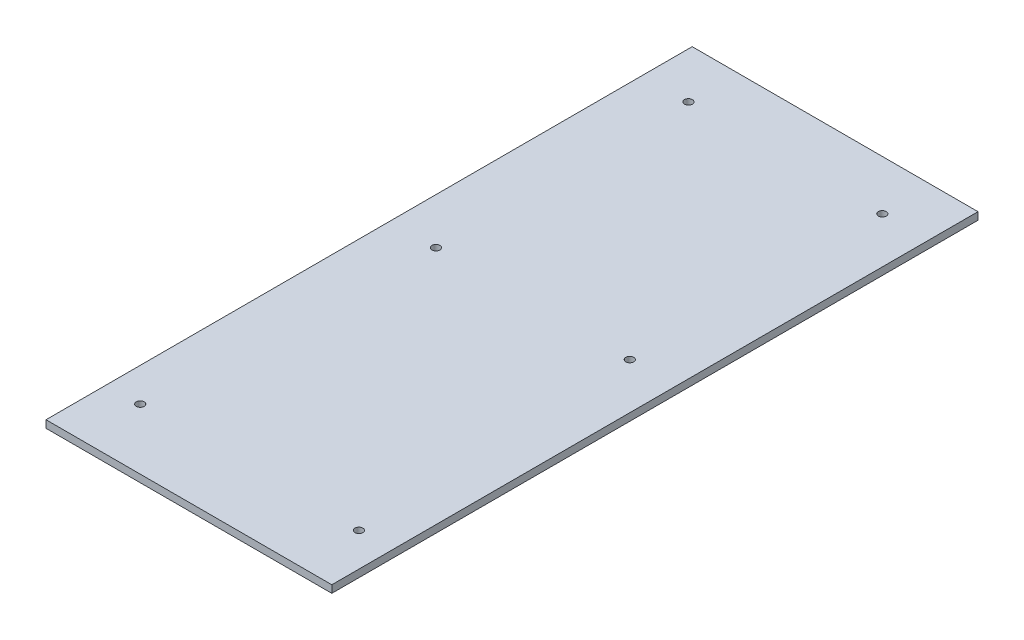
ISO-10303-21;
HEADER;
FILE_DESCRIPTION(('STEP AP214'),'2;1');
FILE_NAME('part.step','',(''),(''),'','','');
FILE_SCHEMA(('AUTOMOTIVE_DESIGN { 1 0 10303 214 1 1 1 1 }'));
ENDSEC;
DATA;
#1=APPLICATION_CONTEXT('core data for automotive mechanical design processes');
#2=APPLICATION_PROTOCOL_DEFINITION('international standard','automotive_design',2000,#1);
#3=PRODUCT_CONTEXT('',#1,'mechanical');
#4=PRODUCT('Part','Part','',(#3));
#5=PRODUCT_RELATED_PRODUCT_CATEGORY('part','',(#4));
#6=PRODUCT_DEFINITION_FORMATION('','',#4);
#7=PRODUCT_DEFINITION_CONTEXT('part definition',#1,'design');
#8=PRODUCT_DEFINITION('design','',#6,#7);
#9=PRODUCT_DEFINITION_SHAPE('','',#8);
#10=(LENGTH_UNIT() NAMED_UNIT(*) SI_UNIT(.MILLI.,.METRE.));
#11=(NAMED_UNIT(*) PLANE_ANGLE_UNIT() SI_UNIT($,.RADIAN.));
#12=(NAMED_UNIT(*) SI_UNIT($,.STERADIAN.) SOLID_ANGLE_UNIT());
#13=UNCERTAINTY_MEASURE_WITH_UNIT(LENGTH_MEASURE(1.E-05),#10,'distance_accuracy_value','');
#14=(GEOMETRIC_REPRESENTATION_CONTEXT(3) GLOBAL_UNCERTAINTY_ASSIGNED_CONTEXT((#13)) GLOBAL_UNIT_ASSIGNED_CONTEXT((#10,
#11,#12)) REPRESENTATION_CONTEXT('',''));
#15=CARTESIAN_POINT('',(0.,0.,0.));
#16=DIRECTION('',(0.,0.,1.));
#17=DIRECTION('',(1.,0.,0.));
#18=AXIS2_PLACEMENT_3D('',#15,#16,#17);
#19=CARTESIAN_POINT('',(-34.9254791999666,3.,-37.0612099424105));
#20=DIRECTION('',(1.,0.,0.));
#21=DIRECTION('',(0.,0.,-1.));
#22=AXIS2_PLACEMENT_3D('',#19,#20,#21);
#23=PLANE('',#22);
#24=DIRECTION('',(0.,0.,1.));
#25=VECTOR('',#24,1.);
#26=CARTESIAN_POINT('',(-34.9254791999666,0.,-37.0612099424105));
#27=LINE('',#26,#25);
#28=CARTESIAN_POINT('',(-34.9254791999666,0.,-37.0612099424105));
#29=VERTEX_POINT('',#28);
#30=CARTESIAN_POINT('',(-34.9254791999665,0.,222.93879005759));
#31=VERTEX_POINT('',#30);
#32=EDGE_CURVE('E96',#29,#31,#27,.T.);
#33=ORIENTED_EDGE('',*,*,#32,.T.);
#34=DIRECTION('',(0.,-1.,0.));
#35=VECTOR('',#34,1.);
#36=CARTESIAN_POINT('',(-34.9254791999665,3.,222.93879005759));
#37=LINE('',#36,#35);
#38=CARTESIAN_POINT('',(-34.9254791999665,3.,222.93879005759));
#39=VERTEX_POINT('',#38);
#40=EDGE_CURVE('E11',#39,#31,#37,.T.);
#41=ORIENTED_EDGE('',*,*,#40,.F.);
#42=DIRECTION('',(0.,0.,1.));
#43=VECTOR('',#42,1.);
#44=CARTESIAN_POINT('',(-34.9254791999666,3.,-37.0612099424105));
#45=LINE('',#44,#43);
#46=CARTESIAN_POINT('',(-34.9254791999666,3.,-37.0612099424105));
#47=VERTEX_POINT('',#46);
#48=EDGE_CURVE('E82',#47,#39,#45,.T.);
#49=ORIENTED_EDGE('',*,*,#48,.F.);
#50=DIRECTION('',(0.,-1.,0.));
#51=VECTOR('',#50,1.);
#52=CARTESIAN_POINT('',(-34.9254791999666,3.,-37.0612099424105));
#53=LINE('',#52,#51);
#54=EDGE_CURVE('E49',#47,#29,#53,.T.);
#55=ORIENTED_EDGE('',*,*,#54,.T.);
#56=EDGE_LOOP('',(#33,#41,#49,#55));
#57=FACE_BOUND('',#56,.T.);
#58=ADVANCED_FACE('F33',(#57),#23,.F.);
#59=CARTESIAN_POINT('',(-34.9254791999665,3.,222.93879005759));
#60=DIRECTION('',(0.,0.,-1.));
#61=DIRECTION('',(-1.,0.,0.));
#62=AXIS2_PLACEMENT_3D('',#59,#60,#61);
#63=PLANE('',#62);
#64=DIRECTION('',(1.,0.,0.));
#65=VECTOR('',#64,1.);
#66=CARTESIAN_POINT('',(-34.9254791999665,0.,222.93879005759));
#67=LINE('',#66,#65);
#68=CARTESIAN_POINT('',(80.0745208000335,0.,222.93879005759));
#69=VERTEX_POINT('',#68);
#70=EDGE_CURVE('E87',#31,#69,#67,.T.);
#71=ORIENTED_EDGE('',*,*,#70,.T.);
#72=DIRECTION('',(0.,-1.,0.));
#73=VECTOR('',#72,1.);
#74=CARTESIAN_POINT('',(80.0745208000335,3.,222.93879005759));
#75=LINE('',#74,#73);
#76=CARTESIAN_POINT('',(80.0745208000335,3.,222.93879005759));
#77=VERTEX_POINT('',#76);
#78=EDGE_CURVE('E41',#77,#69,#75,.T.);
#79=ORIENTED_EDGE('',*,*,#78,.F.);
#80=DIRECTION('',(1.,0.,0.));
#81=VECTOR('',#80,1.);
#82=CARTESIAN_POINT('',(-34.9254791999665,3.,222.93879005759));
#83=LINE('',#82,#81);
#84=EDGE_CURVE('E74',#39,#77,#83,.T.);
#85=ORIENTED_EDGE('',*,*,#84,.F.);
#86=ORIENTED_EDGE('',*,*,#40,.T.);
#87=EDGE_LOOP('',(#71,#79,#85,#86));
#88=FACE_BOUND('',#87,.T.);
#89=ADVANCED_FACE('F86',(#88),#63,.F.);
#90=CARTESIAN_POINT('',(80.0745208000334,3.,-37.0612099424105));
#91=DIRECTION('',(1.,0.,0.));
#92=DIRECTION('',(0.,0.,-1.));
#93=AXIS2_PLACEMENT_3D('',#90,#91,#92);
#94=PLANE('',#93);
#95=DIRECTION('',(0.,0.,1.));
#96=VECTOR('',#95,1.);
#97=CARTESIAN_POINT('',(80.0745208000334,0.,-37.0612099424105));
#98=LINE('',#97,#96);
#99=CARTESIAN_POINT('',(80.0745208000334,0.,-37.0612099424105));
#100=VERTEX_POINT('',#99);
#101=EDGE_CURVE('E100',#100,#69,#98,.T.);
#102=ORIENTED_EDGE('',*,*,#101,.F.);
#103=DIRECTION('',(0.,-1.,0.));
#104=VECTOR('',#103,1.);
#105=CARTESIAN_POINT('',(80.0745208000334,3.,-37.0612099424105));
#106=LINE('',#105,#104);
#107=CARTESIAN_POINT('',(80.0745208000334,3.,-37.0612099424105));
#108=VERTEX_POINT('',#107);
#109=EDGE_CURVE('E63',#108,#100,#106,.T.);
#110=ORIENTED_EDGE('',*,*,#109,.F.);
#111=DIRECTION('',(0.,0.,1.));
#112=VECTOR('',#111,1.);
#113=CARTESIAN_POINT('',(80.0745208000334,3.,-37.0612099424105));
#114=LINE('',#113,#112);
#115=EDGE_CURVE('E81',#108,#77,#114,.T.);
#116=ORIENTED_EDGE('',*,*,#115,.T.);
#117=ORIENTED_EDGE('',*,*,#78,.T.);
#118=EDGE_LOOP('',(#102,#110,#116,#117));
#119=FACE_BOUND('',#118,.T.);
#120=ADVANCED_FACE('F90',(#119),#94,.T.);
#121=CARTESIAN_POINT('',(-34.9254791999666,3.,-37.0612099424105));
#122=DIRECTION('',(0.,0.,-1.));
#123=DIRECTION('',(-1.,0.,0.));
#124=AXIS2_PLACEMENT_3D('',#121,#122,#123);
#125=PLANE('',#124);
#126=DIRECTION('',(1.,0.,0.));
#127=VECTOR('',#126,1.);
#128=CARTESIAN_POINT('',(-34.9254791999666,0.,-37.0612099424105));
#129=LINE('',#128,#127);
#130=EDGE_CURVE('E102',#29,#100,#129,.T.);
#131=ORIENTED_EDGE('',*,*,#130,.F.);
#132=ORIENTED_EDGE('',*,*,#54,.F.);
#133=DIRECTION('',(1.,0.,0.));
#134=VECTOR('',#133,1.);
#135=CARTESIAN_POINT('',(-34.9254791999666,3.,-37.0612099424105));
#136=LINE('',#135,#134);
#137=EDGE_CURVE('E91',#47,#108,#136,.T.);
#138=ORIENTED_EDGE('',*,*,#137,.T.);
#139=ORIENTED_EDGE('',*,*,#109,.T.);
#140=EDGE_LOOP('',(#131,#132,#138,#139));
#141=FACE_BOUND('',#140,.T.);
#142=ADVANCED_FACE('F150',(#141),#125,.T.);
#143=CARTESIAN_POINT('',(0.,3.,0.));
#144=DIRECTION('',(0.,1.,0.));
#145=DIRECTION('',(0.,0.,1.));
#146=AXIS2_PLACEMENT_3D('',#143,#144,#145);
#147=PLANE('',#146);
#148=CARTESIAN_POINT('',(61.5745208000334,3.,-17.0612099424105));
#149=DIRECTION('',(0.,1.,0.));
#150=DIRECTION('',(0.,0.,1.));
#151=AXIS2_PLACEMENT_3D('',#148,#149,#150);
#152=CIRCLE('',#151,1.6);
#153=CARTESIAN_POINT('',(61.5745208000334,3.,-15.4612099424105));
#154=VERTEX_POINT('',#153);
#155=EDGE_CURVE('E140',#154,#154,#152,.T.);
#156=ORIENTED_EDGE('',*,*,#155,.F.);
#157=EDGE_LOOP('',(#156));
#158=FACE_BOUND('',#157,.T.);
#159=CARTESIAN_POINT('',(-16.4254791999666,3.,-17.0612099424105));
#160=DIRECTION('',(0.,1.,0.));
#161=DIRECTION('',(0.,0.,1.));
#162=AXIS2_PLACEMENT_3D('',#159,#160,#161);
#163=CIRCLE('',#162,1.6);
#164=CARTESIAN_POINT('',(-16.4254791999666,3.,-15.4612099424105));
#165=VERTEX_POINT('',#164);
#166=EDGE_CURVE('E134',#165,#165,#163,.T.);
#167=ORIENTED_EDGE('',*,*,#166,.F.);
#168=EDGE_LOOP('',(#167));
#169=FACE_BOUND('',#168,.T.);
#170=CARTESIAN_POINT('',(61.5745208000334,3.,84.5387900575895));
#171=DIRECTION('',(0.,1.,0.));
#172=DIRECTION('',(0.,0.,1.));
#173=AXIS2_PLACEMENT_3D('',#170,#171,#172);
#174=CIRCLE('',#173,1.60000000000001);
#175=CARTESIAN_POINT('',(61.5745208000334,3.,86.1387900575895));
#176=VERTEX_POINT('',#175);
#177=EDGE_CURVE('E128',#176,#176,#174,.T.);
#178=ORIENTED_EDGE('',*,*,#177,.F.);
#179=EDGE_LOOP('',(#178));
#180=FACE_BOUND('',#179,.T.);
#181=CARTESIAN_POINT('',(-16.4254791999666,3.,84.5387900575895));
#182=DIRECTION('',(0.,1.,0.));
#183=DIRECTION('',(0.,0.,1.));
#184=AXIS2_PLACEMENT_3D('',#181,#182,#183);
#185=CIRCLE('',#184,1.6);
#186=CARTESIAN_POINT('',(-16.4254791999666,3.,86.1387900575895));
#187=VERTEX_POINT('',#186);
#188=EDGE_CURVE('E122',#187,#187,#185,.T.);
#189=ORIENTED_EDGE('',*,*,#188,.F.);
#190=EDGE_LOOP('',(#189));
#191=FACE_BOUND('',#190,.T.);
#192=CARTESIAN_POINT('',(66.5745208000334,3.,198.538790057589));
#193=DIRECTION('',(0.,1.,0.));
#194=DIRECTION('',(0.,0.,1.));
#195=AXIS2_PLACEMENT_3D('',#192,#193,#194);
#196=CIRCLE('',#195,1.6);
#197=CARTESIAN_POINT('',(66.5745208000334,3.,200.138790057589));
#198=VERTEX_POINT('',#197);
#199=EDGE_CURVE('E116',#198,#198,#196,.T.);
#200=ORIENTED_EDGE('',*,*,#199,.F.);
#201=EDGE_LOOP('',(#200));
#202=FACE_BOUND('',#201,.T.);
#203=CARTESIAN_POINT('',(-21.4254791999666,3.,198.538790057589));
#204=DIRECTION('',(0.,1.,0.));
#205=DIRECTION('',(0.,0.,1.));
#206=AXIS2_PLACEMENT_3D('',#203,#204,#205);
#207=CIRCLE('',#206,1.59999999999999);
#208=CARTESIAN_POINT('',(-21.4254791999666,3.,200.138790057589));
#209=VERTEX_POINT('',#208);
#210=EDGE_CURVE('E110',#209,#209,#207,.T.);
#211=ORIENTED_EDGE('',*,*,#210,.F.);
#212=EDGE_LOOP('',(#211));
#213=FACE_BOUND('',#212,.T.);
#214=ORIENTED_EDGE('',*,*,#48,.T.);
#215=ORIENTED_EDGE('',*,*,#84,.T.);
#216=ORIENTED_EDGE('',*,*,#115,.F.);
#217=ORIENTED_EDGE('',*,*,#137,.F.);
#218=EDGE_LOOP('',(#214,#215,#216,#217));
#219=FACE_BOUND('',#218,.T.);
#220=ADVANCED_FACE('F78',(#158,#169,#180,#191,#202,#213,#219),#147,.T.);
#221=CARTESIAN_POINT('',(0.,0.,0.));
#222=DIRECTION('',(0.,1.,0.));
#223=DIRECTION('',(0.,0.,1.));
#224=AXIS2_PLACEMENT_3D('',#221,#222,#223);
#225=PLANE('',#224);
#226=CARTESIAN_POINT('',(61.5745208000334,0.,-17.0612099424105));
#227=DIRECTION('',(0.,1.,0.));
#228=DIRECTION('',(0.,0.,1.));
#229=AXIS2_PLACEMENT_3D('',#226,#227,#228);
#230=CIRCLE('',#229,1.6);
#231=CARTESIAN_POINT('',(61.5745208000334,0.,-15.4612099424105));
#232=VERTEX_POINT('',#231);
#233=EDGE_CURVE('E137',#232,#232,#230,.F.);
#234=ORIENTED_EDGE('',*,*,#233,.F.);
#235=EDGE_LOOP('',(#234));
#236=FACE_BOUND('',#235,.T.);
#237=CARTESIAN_POINT('',(-16.4254791999666,0.,-17.0612099424105));
#238=DIRECTION('',(0.,1.,0.));
#239=DIRECTION('',(0.,0.,1.));
#240=AXIS2_PLACEMENT_3D('',#237,#238,#239);
#241=CIRCLE('',#240,1.6);
#242=CARTESIAN_POINT('',(-16.4254791999666,0.,-15.4612099424105));
#243=VERTEX_POINT('',#242);
#244=EDGE_CURVE('E131',#243,#243,#241,.F.);
#245=ORIENTED_EDGE('',*,*,#244,.F.);
#246=EDGE_LOOP('',(#245));
#247=FACE_BOUND('',#246,.T.);
#248=CARTESIAN_POINT('',(61.5745208000334,0.,84.5387900575895));
#249=DIRECTION('',(0.,1.,0.));
#250=DIRECTION('',(0.,0.,1.));
#251=AXIS2_PLACEMENT_3D('',#248,#249,#250);
#252=CIRCLE('',#251,1.60000000000001);
#253=CARTESIAN_POINT('',(61.5745208000334,0.,86.1387900575895));
#254=VERTEX_POINT('',#253);
#255=EDGE_CURVE('E125',#254,#254,#252,.F.);
#256=ORIENTED_EDGE('',*,*,#255,.F.);
#257=EDGE_LOOP('',(#256));
#258=FACE_BOUND('',#257,.T.);
#259=CARTESIAN_POINT('',(-16.4254791999666,0.,84.5387900575895));
#260=DIRECTION('',(0.,1.,0.));
#261=DIRECTION('',(0.,0.,1.));
#262=AXIS2_PLACEMENT_3D('',#259,#260,#261);
#263=CIRCLE('',#262,1.6);
#264=CARTESIAN_POINT('',(-16.4254791999666,0.,86.1387900575895));
#265=VERTEX_POINT('',#264);
#266=EDGE_CURVE('E119',#265,#265,#263,.F.);
#267=ORIENTED_EDGE('',*,*,#266,.F.);
#268=EDGE_LOOP('',(#267));
#269=FACE_BOUND('',#268,.T.);
#270=CARTESIAN_POINT('',(66.5745208000334,0.,198.538790057589));
#271=DIRECTION('',(0.,1.,0.));
#272=DIRECTION('',(0.,0.,1.));
#273=AXIS2_PLACEMENT_3D('',#270,#271,#272);
#274=CIRCLE('',#273,1.6);
#275=CARTESIAN_POINT('',(66.5745208000334,0.,200.138790057589));
#276=VERTEX_POINT('',#275);
#277=EDGE_CURVE('E113',#276,#276,#274,.F.);
#278=ORIENTED_EDGE('',*,*,#277,.F.);
#279=EDGE_LOOP('',(#278));
#280=FACE_BOUND('',#279,.T.);
#281=CARTESIAN_POINT('',(-21.4254791999666,0.,198.538790057589));
#282=DIRECTION('',(0.,1.,0.));
#283=DIRECTION('',(0.,0.,1.));
#284=AXIS2_PLACEMENT_3D('',#281,#282,#283);
#285=CIRCLE('',#284,1.59999999999999);
#286=CARTESIAN_POINT('',(-21.4254791999666,0.,200.138790057589));
#287=VERTEX_POINT('',#286);
#288=EDGE_CURVE('E98',#287,#287,#285,.F.);
#289=ORIENTED_EDGE('',*,*,#288,.F.);
#290=EDGE_LOOP('',(#289));
#291=FACE_BOUND('',#290,.T.);
#292=ORIENTED_EDGE('',*,*,#32,.F.);
#293=ORIENTED_EDGE('',*,*,#130,.T.);
#294=ORIENTED_EDGE('',*,*,#101,.T.);
#295=ORIENTED_EDGE('',*,*,#70,.F.);
#296=EDGE_LOOP('',(#292,#293,#294,#295));
#297=FACE_BOUND('',#296,.T.);
#298=ADVANCED_FACE('F149',(#236,#247,#258,#269,#280,#291,#297),#225,.F.);
#299=CARTESIAN_POINT('',(-21.4254791999666,-0.00100000000000013,198.538790057589));
#300=DIRECTION('',(0.,1.,0.));
#301=DIRECTION('',(0.,0.,1.));
#302=AXIS2_PLACEMENT_3D('',#299,#300,#301);
#303=CYLINDRICAL_SURFACE('',#302,1.59999999999999);
#304=CARTESIAN_POINT('',(-21.4254791999666,3.,200.138790057589));
#305=CARTESIAN_POINT('',(-21.4254791999666,2.96875,200.138790057589));
#306=CARTESIAN_POINT('',(-21.4254791999666,2.9375,200.138790057589));
#307=CARTESIAN_POINT('',(-21.4254791999666,2.875,200.138790057589));
#308=CARTESIAN_POINT('',(-21.4254791999666,2.84375,200.138790057589));
#309=CARTESIAN_POINT('',(-21.4254791999666,2.78125,200.138790057589));
#310=CARTESIAN_POINT('',(-21.4254791999666,2.75,200.138790057589));
#311=CARTESIAN_POINT('',(-21.4254791999666,2.6875,200.138790057589));
#312=CARTESIAN_POINT('',(-21.4254791999666,2.65625,200.138790057589));
#313=CARTESIAN_POINT('',(-21.4254791999666,2.59375,200.138790057589));
#314=CARTESIAN_POINT('',(-21.4254791999666,2.5625,200.138790057589));
#315=CARTESIAN_POINT('',(-21.4254791999666,2.5,200.138790057589));
#316=CARTESIAN_POINT('',(-21.4254791999666,2.46875,200.138790057589));
#317=CARTESIAN_POINT('',(-21.4254791999666,2.40625,200.138790057589));
#318=CARTESIAN_POINT('',(-21.4254791999666,2.375,200.138790057589));
#319=CARTESIAN_POINT('',(-21.4254791999666,2.3125,200.138790057589));
#320=CARTESIAN_POINT('',(-21.4254791999666,2.28125,200.138790057589));
#321=CARTESIAN_POINT('',(-21.4254791999666,2.21875,200.138790057589));
#322=CARTESIAN_POINT('',(-21.4254791999666,2.1875,200.138790057589));
#323=CARTESIAN_POINT('',(-21.4254791999666,2.125,200.138790057589));
#324=CARTESIAN_POINT('',(-21.4254791999666,2.09375,200.138790057589));
#325=CARTESIAN_POINT('',(-21.4254791999666,2.03125,200.138790057589));
#326=CARTESIAN_POINT('',(-21.4254791999666,2.,200.138790057589));
#327=CARTESIAN_POINT('',(-21.4254791999666,1.9375,200.138790057589));
#328=CARTESIAN_POINT('',(-21.4254791999666,1.90625,200.138790057589));
#329=CARTESIAN_POINT('',(-21.4254791999666,1.84375,200.138790057589));
#330=CARTESIAN_POINT('',(-21.4254791999666,1.8125,200.138790057589));
#331=CARTESIAN_POINT('',(-21.4254791999666,1.75,200.138790057589));
#332=CARTESIAN_POINT('',(-21.4254791999666,1.71875,200.138790057589));
#333=CARTESIAN_POINT('',(-21.4254791999666,1.65625,200.138790057589));
#334=CARTESIAN_POINT('',(-21.4254791999666,1.625,200.138790057589));
#335=CARTESIAN_POINT('',(-21.4254791999666,1.5625,200.138790057589));
#336=CARTESIAN_POINT('',(-21.4254791999666,1.53125,200.138790057589));
#337=CARTESIAN_POINT('',(-21.4254791999666,1.46875,200.138790057589));
#338=CARTESIAN_POINT('',(-21.4254791999666,1.4375,200.138790057589));
#339=CARTESIAN_POINT('',(-21.4254791999666,1.375,200.138790057589));
#340=CARTESIAN_POINT('',(-21.4254791999666,1.34375,200.138790057589));
#341=CARTESIAN_POINT('',(-21.4254791999666,1.28125,200.138790057589));
#342=CARTESIAN_POINT('',(-21.4254791999666,1.25,200.138790057589));
#343=CARTESIAN_POINT('',(-21.4254791999666,1.1875,200.138790057589));
#344=CARTESIAN_POINT('',(-21.4254791999666,1.15625,200.138790057589));
#345=CARTESIAN_POINT('',(-21.4254791999666,1.09375,200.138790057589));
#346=CARTESIAN_POINT('',(-21.4254791999666,1.0625,200.138790057589));
#347=CARTESIAN_POINT('',(-21.4254791999666,1.,200.138790057589));
#348=CARTESIAN_POINT('',(-21.4254791999666,0.96875,200.138790057589));
#349=CARTESIAN_POINT('',(-21.4254791999666,0.90625,200.138790057589));
#350=CARTESIAN_POINT('',(-21.4254791999666,0.875,200.138790057589));
#351=CARTESIAN_POINT('',(-21.4254791999666,0.8125,200.138790057589));
#352=CARTESIAN_POINT('',(-21.4254791999666,0.78125,200.138790057589));
#353=CARTESIAN_POINT('',(-21.4254791999666,0.71875,200.138790057589));
#354=CARTESIAN_POINT('',(-21.4254791999666,0.6875,200.138790057589));
#355=CARTESIAN_POINT('',(-21.4254791999666,0.625,200.138790057589));
#356=CARTESIAN_POINT('',(-21.4254791999666,0.59375,200.138790057589));
#357=CARTESIAN_POINT('',(-21.4254791999666,0.53125,200.138790057589));
#358=CARTESIAN_POINT('',(-21.4254791999666,0.5,200.138790057589));
#359=CARTESIAN_POINT('',(-21.4254791999666,0.4375,200.138790057589));
#360=CARTESIAN_POINT('',(-21.4254791999666,0.40625,200.138790057589));
#361=CARTESIAN_POINT('',(-21.4254791999666,0.34375,200.138790057589));
#362=CARTESIAN_POINT('',(-21.4254791999666,0.3125,200.138790057589));
#363=CARTESIAN_POINT('',(-21.4254791999666,0.25,200.138790057589));
#364=CARTESIAN_POINT('',(-21.4254791999666,0.21875,200.138790057589));
#365=CARTESIAN_POINT('',(-21.4254791999666,0.15625,200.138790057589));
#366=CARTESIAN_POINT('',(-21.4254791999666,0.125,200.138790057589));
#367=CARTESIAN_POINT('',(-21.4254791999666,0.0625000000000001,200.138790057589));
#368=CARTESIAN_POINT('',(-21.4254791999666,0.0312500000000001,200.138790057589));
#369=CARTESIAN_POINT('',(-21.4254791999666,0.,200.138790057589));
#370=B_SPLINE_CURVE_WITH_KNOTS('',3,(#304,#305,#306,#307,#308,#309,#310,#311,#312,#313,#314,
#315,#316,#317,#318,#319,#320,#321,#322,#323,#324,#325,#326,#327,#328,#329,#330,#331,#332,#333,
#334,#335,#336,#337,#338,#339,#340,#341,#342,#343,#344,#345,#346,#347,#348,#349,#350,#351,#352,
#353,#354,#355,#356,#357,#358,#359,#360,#361,#362,#363,#364,#365,#366,#367,#368,#369),
.UNSPECIFIED.,.F.,.F.,(4,2,2,2,2,2,2,2,2,2,2,2,2,2,2,2,2,2,2,2,2,2,2,2,2,2,2,2,2,2,2,2,4),(0.,
0.0937500000000001,0.1875,0.28125,0.375,0.46875,0.5625,0.65625,0.75,0.84375,0.9375,1.03125,
1.125,1.21875,1.3125,1.40625,1.5,1.59375,1.6875,1.78125,1.875,1.96875,2.0625,2.15625,2.25,
2.34375,2.4375,2.53125,2.625,2.71875,2.8125,2.90625,3.),.UNSPECIFIED.);
#371=EDGE_CURVE('BSEAM162',#209,#287,#370,.T.);
#372=ORIENTED_EDGE('',*,*,#210,.T.);
#373=ORIENTED_EDGE('',*,*,#288,.T.);
#374=ORIENTED_EDGE('',*,*,#371,.T.);
#375=ORIENTED_EDGE('',*,*,#371,.F.);
#376=EDGE_LOOP('',(#372,#374,#373,#375));
#377=FACE_BOUND('',#376,.T.);
#378=ADVANCED_FACE('F162',(#377),#303,.F.);
#379=CARTESIAN_POINT('',(66.5745208000334,-0.00100000000000013,198.538790057589));
#380=DIRECTION('',(0.,1.,0.));
#381=DIRECTION('',(0.,0.,1.));
#382=AXIS2_PLACEMENT_3D('',#379,#380,#381);
#383=CYLINDRICAL_SURFACE('',#382,1.6);
#384=CARTESIAN_POINT('',(66.5745208000334,3.,200.138790057589));
#385=CARTESIAN_POINT('',(66.5745208000334,2.96875,200.138790057589));
#386=CARTESIAN_POINT('',(66.5745208000334,2.9375,200.138790057589));
#387=CARTESIAN_POINT('',(66.5745208000334,2.875,200.138790057589));
#388=CARTESIAN_POINT('',(66.5745208000334,2.84375,200.138790057589));
#389=CARTESIAN_POINT('',(66.5745208000334,2.78125,200.138790057589));
#390=CARTESIAN_POINT('',(66.5745208000334,2.75,200.138790057589));
#391=CARTESIAN_POINT('',(66.5745208000334,2.6875,200.138790057589));
#392=CARTESIAN_POINT('',(66.5745208000334,2.65625,200.138790057589));
#393=CARTESIAN_POINT('',(66.5745208000334,2.59375,200.138790057589));
#394=CARTESIAN_POINT('',(66.5745208000334,2.5625,200.138790057589));
#395=CARTESIAN_POINT('',(66.5745208000334,2.5,200.138790057589));
#396=CARTESIAN_POINT('',(66.5745208000334,2.46875,200.138790057589));
#397=CARTESIAN_POINT('',(66.5745208000334,2.40625,200.138790057589));
#398=CARTESIAN_POINT('',(66.5745208000334,2.375,200.138790057589));
#399=CARTESIAN_POINT('',(66.5745208000334,2.3125,200.138790057589));
#400=CARTESIAN_POINT('',(66.5745208000334,2.28125,200.138790057589));
#401=CARTESIAN_POINT('',(66.5745208000334,2.21875,200.138790057589));
#402=CARTESIAN_POINT('',(66.5745208000334,2.1875,200.138790057589));
#403=CARTESIAN_POINT('',(66.5745208000334,2.125,200.138790057589));
#404=CARTESIAN_POINT('',(66.5745208000334,2.09375,200.138790057589));
#405=CARTESIAN_POINT('',(66.5745208000334,2.03125,200.138790057589));
#406=CARTESIAN_POINT('',(66.5745208000334,2.,200.138790057589));
#407=CARTESIAN_POINT('',(66.5745208000334,1.9375,200.138790057589));
#408=CARTESIAN_POINT('',(66.5745208000334,1.90625,200.138790057589));
#409=CARTESIAN_POINT('',(66.5745208000334,1.84375,200.138790057589));
#410=CARTESIAN_POINT('',(66.5745208000334,1.8125,200.138790057589));
#411=CARTESIAN_POINT('',(66.5745208000334,1.75,200.138790057589));
#412=CARTESIAN_POINT('',(66.5745208000334,1.71875,200.138790057589));
#413=CARTESIAN_POINT('',(66.5745208000334,1.65625,200.138790057589));
#414=CARTESIAN_POINT('',(66.5745208000334,1.625,200.138790057589));
#415=CARTESIAN_POINT('',(66.5745208000334,1.5625,200.138790057589));
#416=CARTESIAN_POINT('',(66.5745208000334,1.53125,200.138790057589));
#417=CARTESIAN_POINT('',(66.5745208000334,1.46875,200.138790057589));
#418=CARTESIAN_POINT('',(66.5745208000334,1.4375,200.138790057589));
#419=CARTESIAN_POINT('',(66.5745208000334,1.375,200.138790057589));
#420=CARTESIAN_POINT('',(66.5745208000334,1.34375,200.138790057589));
#421=CARTESIAN_POINT('',(66.5745208000334,1.28125,200.138790057589));
#422=CARTESIAN_POINT('',(66.5745208000334,1.25,200.138790057589));
#423=CARTESIAN_POINT('',(66.5745208000334,1.1875,200.138790057589));
#424=CARTESIAN_POINT('',(66.5745208000334,1.15625,200.138790057589));
#425=CARTESIAN_POINT('',(66.5745208000334,1.09375,200.138790057589));
#426=CARTESIAN_POINT('',(66.5745208000334,1.0625,200.138790057589));
#427=CARTESIAN_POINT('',(66.5745208000334,1.,200.138790057589));
#428=CARTESIAN_POINT('',(66.5745208000334,0.96875,200.138790057589));
#429=CARTESIAN_POINT('',(66.5745208000334,0.90625,200.138790057589));
#430=CARTESIAN_POINT('',(66.5745208000334,0.875,200.138790057589));
#431=CARTESIAN_POINT('',(66.5745208000334,0.8125,200.138790057589));
#432=CARTESIAN_POINT('',(66.5745208000334,0.78125,200.138790057589));
#433=CARTESIAN_POINT('',(66.5745208000334,0.71875,200.138790057589));
#434=CARTESIAN_POINT('',(66.5745208000334,0.6875,200.138790057589));
#435=CARTESIAN_POINT('',(66.5745208000334,0.625,200.138790057589));
#436=CARTESIAN_POINT('',(66.5745208000334,0.59375,200.138790057589));
#437=CARTESIAN_POINT('',(66.5745208000334,0.53125,200.138790057589));
#438=CARTESIAN_POINT('',(66.5745208000334,0.5,200.138790057589));
#439=CARTESIAN_POINT('',(66.5745208000334,0.4375,200.138790057589));
#440=CARTESIAN_POINT('',(66.5745208000334,0.40625,200.138790057589));
#441=CARTESIAN_POINT('',(66.5745208000334,0.34375,200.138790057589));
#442=CARTESIAN_POINT('',(66.5745208000334,0.3125,200.138790057589));
#443=CARTESIAN_POINT('',(66.5745208000334,0.25,200.138790057589));
#444=CARTESIAN_POINT('',(66.5745208000334,0.21875,200.138790057589));
#445=CARTESIAN_POINT('',(66.5745208000334,0.15625,200.138790057589));
#446=CARTESIAN_POINT('',(66.5745208000334,0.125,200.138790057589));
#447=CARTESIAN_POINT('',(66.5745208000334,0.0625000000000001,200.138790057589));
#448=CARTESIAN_POINT('',(66.5745208000334,0.0312500000000001,200.138790057589));
#449=CARTESIAN_POINT('',(66.5745208000334,0.,200.138790057589));
#450=B_SPLINE_CURVE_WITH_KNOTS('',3,(#384,#385,#386,#387,#388,#389,#390,#391,#392,#393,#394,
#395,#396,#397,#398,#399,#400,#401,#402,#403,#404,#405,#406,#407,#408,#409,#410,#411,#412,#413,
#414,#415,#416,#417,#418,#419,#420,#421,#422,#423,#424,#425,#426,#427,#428,#429,#430,#431,#432,
#433,#434,#435,#436,#437,#438,#439,#440,#441,#442,#443,#444,#445,#446,#447,#448,#449),
.UNSPECIFIED.,.F.,.F.,(4,2,2,2,2,2,2,2,2,2,2,2,2,2,2,2,2,2,2,2,2,2,2,2,2,2,2,2,2,2,2,2,4),(0.,
0.0937500000000001,0.1875,0.28125,0.375,0.46875,0.5625,0.65625,0.75,0.84375,0.9375,1.03125,
1.125,1.21875,1.3125,1.40625,1.5,1.59375,1.6875,1.78125,1.875,1.96875,2.0625,2.15625,2.25,
2.34375,2.4375,2.53125,2.625,2.71875,2.8125,2.90625,3.),.UNSPECIFIED.);
#451=EDGE_CURVE('BSEAM165',#198,#276,#450,.T.);
#452=ORIENTED_EDGE('',*,*,#199,.T.);
#453=ORIENTED_EDGE('',*,*,#277,.T.);
#454=ORIENTED_EDGE('',*,*,#451,.T.);
#455=ORIENTED_EDGE('',*,*,#451,.F.);
#456=EDGE_LOOP('',(#452,#454,#453,#455));
#457=FACE_BOUND('',#456,.T.);
#458=ADVANCED_FACE('F165',(#457),#383,.F.);
#459=CARTESIAN_POINT('',(-16.4254791999666,-0.00100000000000013,84.5387900575895));
#460=DIRECTION('',(0.,1.,0.));
#461=DIRECTION('',(0.,0.,1.));
#462=AXIS2_PLACEMENT_3D('',#459,#460,#461);
#463=CYLINDRICAL_SURFACE('',#462,1.6);
#464=CARTESIAN_POINT('',(-16.4254791999666,3.,86.1387900575895));
#465=CARTESIAN_POINT('',(-16.4254791999666,2.96875,86.1387900575895));
#466=CARTESIAN_POINT('',(-16.4254791999666,2.9375,86.1387900575895));
#467=CARTESIAN_POINT('',(-16.4254791999666,2.875,86.1387900575895));
#468=CARTESIAN_POINT('',(-16.4254791999666,2.84375,86.1387900575895));
#469=CARTESIAN_POINT('',(-16.4254791999666,2.78125,86.1387900575895));
#470=CARTESIAN_POINT('',(-16.4254791999666,2.75,86.1387900575895));
#471=CARTESIAN_POINT('',(-16.4254791999666,2.6875,86.1387900575895));
#472=CARTESIAN_POINT('',(-16.4254791999666,2.65625,86.1387900575895));
#473=CARTESIAN_POINT('',(-16.4254791999666,2.59375,86.1387900575895));
#474=CARTESIAN_POINT('',(-16.4254791999666,2.5625,86.1387900575895));
#475=CARTESIAN_POINT('',(-16.4254791999666,2.5,86.1387900575895));
#476=CARTESIAN_POINT('',(-16.4254791999666,2.46875,86.1387900575895));
#477=CARTESIAN_POINT('',(-16.4254791999666,2.40625,86.1387900575895));
#478=CARTESIAN_POINT('',(-16.4254791999666,2.375,86.1387900575895));
#479=CARTESIAN_POINT('',(-16.4254791999666,2.3125,86.1387900575895));
#480=CARTESIAN_POINT('',(-16.4254791999666,2.28125,86.1387900575895));
#481=CARTESIAN_POINT('',(-16.4254791999666,2.21875,86.1387900575895));
#482=CARTESIAN_POINT('',(-16.4254791999666,2.1875,86.1387900575895));
#483=CARTESIAN_POINT('',(-16.4254791999666,2.125,86.1387900575895));
#484=CARTESIAN_POINT('',(-16.4254791999666,2.09375,86.1387900575895));
#485=CARTESIAN_POINT('',(-16.4254791999666,2.03125,86.1387900575895));
#486=CARTESIAN_POINT('',(-16.4254791999666,2.,86.1387900575895));
#487=CARTESIAN_POINT('',(-16.4254791999666,1.9375,86.1387900575895));
#488=CARTESIAN_POINT('',(-16.4254791999666,1.90625,86.1387900575895));
#489=CARTESIAN_POINT('',(-16.4254791999666,1.84375,86.1387900575895));
#490=CARTESIAN_POINT('',(-16.4254791999666,1.8125,86.1387900575895));
#491=CARTESIAN_POINT('',(-16.4254791999666,1.75,86.1387900575895));
#492=CARTESIAN_POINT('',(-16.4254791999666,1.71875,86.1387900575895));
#493=CARTESIAN_POINT('',(-16.4254791999666,1.65625,86.1387900575895));
#494=CARTESIAN_POINT('',(-16.4254791999666,1.625,86.1387900575895));
#495=CARTESIAN_POINT('',(-16.4254791999666,1.5625,86.1387900575895));
#496=CARTESIAN_POINT('',(-16.4254791999666,1.53125,86.1387900575895));
#497=CARTESIAN_POINT('',(-16.4254791999666,1.46875,86.1387900575895));
#498=CARTESIAN_POINT('',(-16.4254791999666,1.4375,86.1387900575895));
#499=CARTESIAN_POINT('',(-16.4254791999666,1.375,86.1387900575895));
#500=CARTESIAN_POINT('',(-16.4254791999666,1.34375,86.1387900575895));
#501=CARTESIAN_POINT('',(-16.4254791999666,1.28125,86.1387900575895));
#502=CARTESIAN_POINT('',(-16.4254791999666,1.25,86.1387900575895));
#503=CARTESIAN_POINT('',(-16.4254791999666,1.1875,86.1387900575895));
#504=CARTESIAN_POINT('',(-16.4254791999666,1.15625,86.1387900575895));
#505=CARTESIAN_POINT('',(-16.4254791999666,1.09375,86.1387900575895));
#506=CARTESIAN_POINT('',(-16.4254791999666,1.0625,86.1387900575895));
#507=CARTESIAN_POINT('',(-16.4254791999666,1.,86.1387900575895));
#508=CARTESIAN_POINT('',(-16.4254791999666,0.96875,86.1387900575895));
#509=CARTESIAN_POINT('',(-16.4254791999666,0.90625,86.1387900575895));
#510=CARTESIAN_POINT('',(-16.4254791999666,0.875,86.1387900575895));
#511=CARTESIAN_POINT('',(-16.4254791999666,0.8125,86.1387900575895));
#512=CARTESIAN_POINT('',(-16.4254791999666,0.78125,86.1387900575895));
#513=CARTESIAN_POINT('',(-16.4254791999666,0.71875,86.1387900575895));
#514=CARTESIAN_POINT('',(-16.4254791999666,0.6875,86.1387900575895));
#515=CARTESIAN_POINT('',(-16.4254791999666,0.625,86.1387900575895));
#516=CARTESIAN_POINT('',(-16.4254791999666,0.59375,86.1387900575895));
#517=CARTESIAN_POINT('',(-16.4254791999666,0.53125,86.1387900575895));
#518=CARTESIAN_POINT('',(-16.4254791999666,0.5,86.1387900575895));
#519=CARTESIAN_POINT('',(-16.4254791999666,0.4375,86.1387900575895));
#520=CARTESIAN_POINT('',(-16.4254791999666,0.40625,86.1387900575895));
#521=CARTESIAN_POINT('',(-16.4254791999666,0.34375,86.1387900575895));
#522=CARTESIAN_POINT('',(-16.4254791999666,0.3125,86.1387900575895));
#523=CARTESIAN_POINT('',(-16.4254791999666,0.25,86.1387900575895));
#524=CARTESIAN_POINT('',(-16.4254791999666,0.21875,86.1387900575895));
#525=CARTESIAN_POINT('',(-16.4254791999666,0.15625,86.1387900575895));
#526=CARTESIAN_POINT('',(-16.4254791999666,0.125,86.1387900575895));
#527=CARTESIAN_POINT('',(-16.4254791999666,0.0625000000000001,86.1387900575895));
#528=CARTESIAN_POINT('',(-16.4254791999666,0.0312500000000001,86.1387900575895));
#529=CARTESIAN_POINT('',(-16.4254791999666,0.,86.1387900575895));
#530=B_SPLINE_CURVE_WITH_KNOTS('',3,(#464,#465,#466,#467,#468,#469,#470,#471,#472,#473,#474,
#475,#476,#477,#478,#479,#480,#481,#482,#483,#484,#485,#486,#487,#488,#489,#490,#491,#492,#493,
#494,#495,#496,#497,#498,#499,#500,#501,#502,#503,#504,#505,#506,#507,#508,#509,#510,#511,#512,
#513,#514,#515,#516,#517,#518,#519,#520,#521,#522,#523,#524,#525,#526,#527,#528,#529),
.UNSPECIFIED.,.F.,.F.,(4,2,2,2,2,2,2,2,2,2,2,2,2,2,2,2,2,2,2,2,2,2,2,2,2,2,2,2,2,2,2,2,4),(0.,
0.0937500000000001,0.1875,0.28125,0.375,0.46875,0.5625,0.65625,0.75,0.84375,0.9375,1.03125,
1.125,1.21875,1.3125,1.40625,1.5,1.59375,1.6875,1.78125,1.875,1.96875,2.0625,2.15625,2.25,
2.34375,2.4375,2.53125,2.625,2.71875,2.8125,2.90625,3.),.UNSPECIFIED.);
#531=EDGE_CURVE('BSEAM219',#187,#265,#530,.T.);
#532=ORIENTED_EDGE('',*,*,#188,.T.);
#533=ORIENTED_EDGE('',*,*,#266,.T.);
#534=ORIENTED_EDGE('',*,*,#531,.T.);
#535=ORIENTED_EDGE('',*,*,#531,.F.);
#536=EDGE_LOOP('',(#532,#534,#533,#535));
#537=FACE_BOUND('',#536,.T.);
#538=ADVANCED_FACE('F219',(#537),#463,.F.);
#539=CARTESIAN_POINT('',(61.5745208000334,-0.00100000000000013,84.5387900575895));
#540=DIRECTION('',(0.,1.,0.));
#541=DIRECTION('',(0.,0.,1.));
#542=AXIS2_PLACEMENT_3D('',#539,#540,#541);
#543=CYLINDRICAL_SURFACE('',#542,1.60000000000001);
#544=CARTESIAN_POINT('',(61.5745208000334,3.,86.1387900575895));
#545=CARTESIAN_POINT('',(61.5745208000334,2.96875,86.1387900575895));
#546=CARTESIAN_POINT('',(61.5745208000334,2.9375,86.1387900575895));
#547=CARTESIAN_POINT('',(61.5745208000334,2.875,86.1387900575895));
#548=CARTESIAN_POINT('',(61.5745208000334,2.84375,86.1387900575895));
#549=CARTESIAN_POINT('',(61.5745208000334,2.78125,86.1387900575895));
#550=CARTESIAN_POINT('',(61.5745208000334,2.75,86.1387900575895));
#551=CARTESIAN_POINT('',(61.5745208000334,2.6875,86.1387900575895));
#552=CARTESIAN_POINT('',(61.5745208000334,2.65625,86.1387900575895));
#553=CARTESIAN_POINT('',(61.5745208000334,2.59375,86.1387900575895));
#554=CARTESIAN_POINT('',(61.5745208000334,2.5625,86.1387900575895));
#555=CARTESIAN_POINT('',(61.5745208000334,2.5,86.1387900575895));
#556=CARTESIAN_POINT('',(61.5745208000334,2.46875,86.1387900575895));
#557=CARTESIAN_POINT('',(61.5745208000334,2.40625,86.1387900575895));
#558=CARTESIAN_POINT('',(61.5745208000334,2.375,86.1387900575895));
#559=CARTESIAN_POINT('',(61.5745208000334,2.3125,86.1387900575895));
#560=CARTESIAN_POINT('',(61.5745208000334,2.28125,86.1387900575895));
#561=CARTESIAN_POINT('',(61.5745208000334,2.21875,86.1387900575895));
#562=CARTESIAN_POINT('',(61.5745208000334,2.1875,86.1387900575895));
#563=CARTESIAN_POINT('',(61.5745208000334,2.125,86.1387900575895));
#564=CARTESIAN_POINT('',(61.5745208000334,2.09375,86.1387900575895));
#565=CARTESIAN_POINT('',(61.5745208000334,2.03125,86.1387900575895));
#566=CARTESIAN_POINT('',(61.5745208000334,2.,86.1387900575895));
#567=CARTESIAN_POINT('',(61.5745208000334,1.9375,86.1387900575895));
#568=CARTESIAN_POINT('',(61.5745208000334,1.90625,86.1387900575895));
#569=CARTESIAN_POINT('',(61.5745208000334,1.84375,86.1387900575895));
#570=CARTESIAN_POINT('',(61.5745208000334,1.8125,86.1387900575895));
#571=CARTESIAN_POINT('',(61.5745208000334,1.75,86.1387900575895));
#572=CARTESIAN_POINT('',(61.5745208000334,1.71875,86.1387900575895));
#573=CARTESIAN_POINT('',(61.5745208000334,1.65625,86.1387900575895));
#574=CARTESIAN_POINT('',(61.5745208000334,1.625,86.1387900575895));
#575=CARTESIAN_POINT('',(61.5745208000334,1.5625,86.1387900575895));
#576=CARTESIAN_POINT('',(61.5745208000334,1.53125,86.1387900575895));
#577=CARTESIAN_POINT('',(61.5745208000334,1.46875,86.1387900575895));
#578=CARTESIAN_POINT('',(61.5745208000334,1.4375,86.1387900575895));
#579=CARTESIAN_POINT('',(61.5745208000334,1.375,86.1387900575895));
#580=CARTESIAN_POINT('',(61.5745208000334,1.34375,86.1387900575895));
#581=CARTESIAN_POINT('',(61.5745208000334,1.28125,86.1387900575895));
#582=CARTESIAN_POINT('',(61.5745208000334,1.25,86.1387900575895));
#583=CARTESIAN_POINT('',(61.5745208000334,1.1875,86.1387900575895));
#584=CARTESIAN_POINT('',(61.5745208000334,1.15625,86.1387900575895));
#585=CARTESIAN_POINT('',(61.5745208000334,1.09375,86.1387900575895));
#586=CARTESIAN_POINT('',(61.5745208000334,1.0625,86.1387900575895));
#587=CARTESIAN_POINT('',(61.5745208000334,1.,86.1387900575895));
#588=CARTESIAN_POINT('',(61.5745208000334,0.96875,86.1387900575895));
#589=CARTESIAN_POINT('',(61.5745208000334,0.90625,86.1387900575895));
#590=CARTESIAN_POINT('',(61.5745208000334,0.875,86.1387900575895));
#591=CARTESIAN_POINT('',(61.5745208000334,0.8125,86.1387900575895));
#592=CARTESIAN_POINT('',(61.5745208000334,0.78125,86.1387900575895));
#593=CARTESIAN_POINT('',(61.5745208000334,0.71875,86.1387900575895));
#594=CARTESIAN_POINT('',(61.5745208000334,0.6875,86.1387900575895));
#595=CARTESIAN_POINT('',(61.5745208000334,0.625,86.1387900575895));
#596=CARTESIAN_POINT('',(61.5745208000334,0.59375,86.1387900575895));
#597=CARTESIAN_POINT('',(61.5745208000334,0.53125,86.1387900575895));
#598=CARTESIAN_POINT('',(61.5745208000334,0.5,86.1387900575895));
#599=CARTESIAN_POINT('',(61.5745208000334,0.4375,86.1387900575895));
#600=CARTESIAN_POINT('',(61.5745208000334,0.40625,86.1387900575895));
#601=CARTESIAN_POINT('',(61.5745208000334,0.34375,86.1387900575895));
#602=CARTESIAN_POINT('',(61.5745208000334,0.3125,86.1387900575895));
#603=CARTESIAN_POINT('',(61.5745208000334,0.25,86.1387900575895));
#604=CARTESIAN_POINT('',(61.5745208000334,0.21875,86.1387900575895));
#605=CARTESIAN_POINT('',(61.5745208000334,0.15625,86.1387900575895));
#606=CARTESIAN_POINT('',(61.5745208000334,0.125,86.1387900575895));
#607=CARTESIAN_POINT('',(61.5745208000334,0.0625000000000001,86.1387900575895));
#608=CARTESIAN_POINT('',(61.5745208000334,0.0312500000000001,86.1387900575895));
#609=CARTESIAN_POINT('',(61.5745208000334,0.,86.1387900575895));
#610=B_SPLINE_CURVE_WITH_KNOTS('',3,(#544,#545,#546,#547,#548,#549,#550,#551,#552,#553,#554,
#555,#556,#557,#558,#559,#560,#561,#562,#563,#564,#565,#566,#567,#568,#569,#570,#571,#572,#573,
#574,#575,#576,#577,#578,#579,#580,#581,#582,#583,#584,#585,#586,#587,#588,#589,#590,#591,#592,
#593,#594,#595,#596,#597,#598,#599,#600,#601,#602,#603,#604,#605,#606,#607,#608,#609),
.UNSPECIFIED.,.F.,.F.,(4,2,2,2,2,2,2,2,2,2,2,2,2,2,2,2,2,2,2,2,2,2,2,2,2,2,2,2,2,2,2,2,4),(0.,
0.0937500000000001,0.1875,0.28125,0.375,0.46875,0.5625,0.65625,0.75,0.84375,0.9375,1.03125,
1.125,1.21875,1.3125,1.40625,1.5,1.59375,1.6875,1.78125,1.875,1.96875,2.0625,2.15625,2.25,
2.34375,2.4375,2.53125,2.625,2.71875,2.8125,2.90625,3.),.UNSPECIFIED.);
#611=EDGE_CURVE('BSEAM229',#176,#254,#610,.T.);
#612=ORIENTED_EDGE('',*,*,#177,.T.);
#613=ORIENTED_EDGE('',*,*,#255,.T.);
#614=ORIENTED_EDGE('',*,*,#611,.T.);
#615=ORIENTED_EDGE('',*,*,#611,.F.);
#616=EDGE_LOOP('',(#612,#614,#613,#615));
#617=FACE_BOUND('',#616,.T.);
#618=ADVANCED_FACE('F229',(#617),#543,.F.);
#619=CARTESIAN_POINT('',(-16.4254791999666,-0.00100000000000013,-17.0612099424105));
#620=DIRECTION('',(0.,1.,0.));
#621=DIRECTION('',(0.,0.,1.));
#622=AXIS2_PLACEMENT_3D('',#619,#620,#621);
#623=CYLINDRICAL_SURFACE('',#622,1.6);
#624=CARTESIAN_POINT('',(-16.4254791999666,3.,-15.4612099424105));
#625=CARTESIAN_POINT('',(-16.4254791999666,2.96875,-15.4612099424105));
#626=CARTESIAN_POINT('',(-16.4254791999666,2.9375,-15.4612099424105));
#627=CARTESIAN_POINT('',(-16.4254791999666,2.875,-15.4612099424105));
#628=CARTESIAN_POINT('',(-16.4254791999666,2.84375,-15.4612099424105));
#629=CARTESIAN_POINT('',(-16.4254791999666,2.78125,-15.4612099424105));
#630=CARTESIAN_POINT('',(-16.4254791999666,2.75,-15.4612099424105));
#631=CARTESIAN_POINT('',(-16.4254791999666,2.6875,-15.4612099424105));
#632=CARTESIAN_POINT('',(-16.4254791999666,2.65625,-15.4612099424105));
#633=CARTESIAN_POINT('',(-16.4254791999666,2.59375,-15.4612099424105));
#634=CARTESIAN_POINT('',(-16.4254791999666,2.5625,-15.4612099424105));
#635=CARTESIAN_POINT('',(-16.4254791999666,2.5,-15.4612099424105));
#636=CARTESIAN_POINT('',(-16.4254791999666,2.46875,-15.4612099424105));
#637=CARTESIAN_POINT('',(-16.4254791999666,2.40625,-15.4612099424105));
#638=CARTESIAN_POINT('',(-16.4254791999666,2.375,-15.4612099424105));
#639=CARTESIAN_POINT('',(-16.4254791999666,2.3125,-15.4612099424105));
#640=CARTESIAN_POINT('',(-16.4254791999666,2.28125,-15.4612099424105));
#641=CARTESIAN_POINT('',(-16.4254791999666,2.21875,-15.4612099424105));
#642=CARTESIAN_POINT('',(-16.4254791999666,2.1875,-15.4612099424105));
#643=CARTESIAN_POINT('',(-16.4254791999666,2.125,-15.4612099424105));
#644=CARTESIAN_POINT('',(-16.4254791999666,2.09375,-15.4612099424105));
#645=CARTESIAN_POINT('',(-16.4254791999666,2.03125,-15.4612099424105));
#646=CARTESIAN_POINT('',(-16.4254791999666,2.,-15.4612099424105));
#647=CARTESIAN_POINT('',(-16.4254791999666,1.9375,-15.4612099424105));
#648=CARTESIAN_POINT('',(-16.4254791999666,1.90625,-15.4612099424105));
#649=CARTESIAN_POINT('',(-16.4254791999666,1.84375,-15.4612099424105));
#650=CARTESIAN_POINT('',(-16.4254791999666,1.8125,-15.4612099424105));
#651=CARTESIAN_POINT('',(-16.4254791999666,1.75,-15.4612099424105));
#652=CARTESIAN_POINT('',(-16.4254791999666,1.71875,-15.4612099424105));
#653=CARTESIAN_POINT('',(-16.4254791999666,1.65625,-15.4612099424105));
#654=CARTESIAN_POINT('',(-16.4254791999666,1.625,-15.4612099424105));
#655=CARTESIAN_POINT('',(-16.4254791999666,1.5625,-15.4612099424105));
#656=CARTESIAN_POINT('',(-16.4254791999666,1.53125,-15.4612099424105));
#657=CARTESIAN_POINT('',(-16.4254791999666,1.46875,-15.4612099424105));
#658=CARTESIAN_POINT('',(-16.4254791999666,1.4375,-15.4612099424105));
#659=CARTESIAN_POINT('',(-16.4254791999666,1.375,-15.4612099424105));
#660=CARTESIAN_POINT('',(-16.4254791999666,1.34375,-15.4612099424105));
#661=CARTESIAN_POINT('',(-16.4254791999666,1.28125,-15.4612099424105));
#662=CARTESIAN_POINT('',(-16.4254791999666,1.25,-15.4612099424105));
#663=CARTESIAN_POINT('',(-16.4254791999666,1.1875,-15.4612099424105));
#664=CARTESIAN_POINT('',(-16.4254791999666,1.15625,-15.4612099424105));
#665=CARTESIAN_POINT('',(-16.4254791999666,1.09375,-15.4612099424105));
#666=CARTESIAN_POINT('',(-16.4254791999666,1.0625,-15.4612099424105));
#667=CARTESIAN_POINT('',(-16.4254791999666,1.,-15.4612099424105));
#668=CARTESIAN_POINT('',(-16.4254791999666,0.96875,-15.4612099424105));
#669=CARTESIAN_POINT('',(-16.4254791999666,0.90625,-15.4612099424105));
#670=CARTESIAN_POINT('',(-16.4254791999666,0.875,-15.4612099424105));
#671=CARTESIAN_POINT('',(-16.4254791999666,0.8125,-15.4612099424105));
#672=CARTESIAN_POINT('',(-16.4254791999666,0.78125,-15.4612099424105));
#673=CARTESIAN_POINT('',(-16.4254791999666,0.71875,-15.4612099424105));
#674=CARTESIAN_POINT('',(-16.4254791999666,0.6875,-15.4612099424105));
#675=CARTESIAN_POINT('',(-16.4254791999666,0.625,-15.4612099424105));
#676=CARTESIAN_POINT('',(-16.4254791999666,0.59375,-15.4612099424105));
#677=CARTESIAN_POINT('',(-16.4254791999666,0.53125,-15.4612099424105));
#678=CARTESIAN_POINT('',(-16.4254791999666,0.5,-15.4612099424105));
#679=CARTESIAN_POINT('',(-16.4254791999666,0.4375,-15.4612099424105));
#680=CARTESIAN_POINT('',(-16.4254791999666,0.40625,-15.4612099424105));
#681=CARTESIAN_POINT('',(-16.4254791999666,0.34375,-15.4612099424105));
#682=CARTESIAN_POINT('',(-16.4254791999666,0.3125,-15.4612099424105));
#683=CARTESIAN_POINT('',(-16.4254791999666,0.25,-15.4612099424105));
#684=CARTESIAN_POINT('',(-16.4254791999666,0.21875,-15.4612099424105));
#685=CARTESIAN_POINT('',(-16.4254791999666,0.15625,-15.4612099424105));
#686=CARTESIAN_POINT('',(-16.4254791999666,0.125,-15.4612099424105));
#687=CARTESIAN_POINT('',(-16.4254791999666,0.0625000000000001,-15.4612099424105));
#688=CARTESIAN_POINT('',(-16.4254791999666,0.0312500000000001,-15.4612099424105));
#689=CARTESIAN_POINT('',(-16.4254791999666,0.,-15.4612099424105));
#690=B_SPLINE_CURVE_WITH_KNOTS('',3,(#624,#625,#626,#627,#628,#629,#630,#631,#632,#633,#634,
#635,#636,#637,#638,#639,#640,#641,#642,#643,#644,#645,#646,#647,#648,#649,#650,#651,#652,#653,
#654,#655,#656,#657,#658,#659,#660,#661,#662,#663,#664,#665,#666,#667,#668,#669,#670,#671,#672,
#673,#674,#675,#676,#677,#678,#679,#680,#681,#682,#683,#684,#685,#686,#687,#688,#689),
.UNSPECIFIED.,.F.,.F.,(4,2,2,2,2,2,2,2,2,2,2,2,2,2,2,2,2,2,2,2,2,2,2,2,2,2,2,2,2,2,2,2,4),(0.,
0.0937500000000001,0.1875,0.28125,0.375,0.46875,0.5625,0.65625,0.75,0.84375,0.9375,1.03125,
1.125,1.21875,1.3125,1.40625,1.5,1.59375,1.6875,1.78125,1.875,1.96875,2.0625,2.15625,2.25,
2.34375,2.4375,2.53125,2.625,2.71875,2.8125,2.90625,3.),.UNSPECIFIED.);
#691=EDGE_CURVE('BSEAM239',#165,#243,#690,.T.);
#692=ORIENTED_EDGE('',*,*,#166,.T.);
#693=ORIENTED_EDGE('',*,*,#244,.T.);
#694=ORIENTED_EDGE('',*,*,#691,.T.);
#695=ORIENTED_EDGE('',*,*,#691,.F.);
#696=EDGE_LOOP('',(#692,#694,#693,#695));
#697=FACE_BOUND('',#696,.T.);
#698=ADVANCED_FACE('F239',(#697),#623,.F.);
#699=CARTESIAN_POINT('',(61.5745208000334,-0.00100000000000013,-17.0612099424105));
#700=DIRECTION('',(0.,1.,0.));
#701=DIRECTION('',(0.,0.,1.));
#702=AXIS2_PLACEMENT_3D('',#699,#700,#701);
#703=CYLINDRICAL_SURFACE('',#702,1.6);
#704=CARTESIAN_POINT('',(61.5745208000334,3.,-15.4612099424105));
#705=CARTESIAN_POINT('',(61.5745208000334,2.96875,-15.4612099424105));
#706=CARTESIAN_POINT('',(61.5745208000334,2.9375,-15.4612099424105));
#707=CARTESIAN_POINT('',(61.5745208000334,2.875,-15.4612099424105));
#708=CARTESIAN_POINT('',(61.5745208000334,2.84375,-15.4612099424105));
#709=CARTESIAN_POINT('',(61.5745208000334,2.78125,-15.4612099424105));
#710=CARTESIAN_POINT('',(61.5745208000334,2.75,-15.4612099424105));
#711=CARTESIAN_POINT('',(61.5745208000334,2.6875,-15.4612099424105));
#712=CARTESIAN_POINT('',(61.5745208000334,2.65625,-15.4612099424105));
#713=CARTESIAN_POINT('',(61.5745208000334,2.59375,-15.4612099424105));
#714=CARTESIAN_POINT('',(61.5745208000334,2.5625,-15.4612099424105));
#715=CARTESIAN_POINT('',(61.5745208000334,2.5,-15.4612099424105));
#716=CARTESIAN_POINT('',(61.5745208000334,2.46875,-15.4612099424105));
#717=CARTESIAN_POINT('',(61.5745208000334,2.40625,-15.4612099424105));
#718=CARTESIAN_POINT('',(61.5745208000334,2.375,-15.4612099424105));
#719=CARTESIAN_POINT('',(61.5745208000334,2.3125,-15.4612099424105));
#720=CARTESIAN_POINT('',(61.5745208000334,2.28125,-15.4612099424105));
#721=CARTESIAN_POINT('',(61.5745208000334,2.21875,-15.4612099424105));
#722=CARTESIAN_POINT('',(61.5745208000334,2.1875,-15.4612099424105));
#723=CARTESIAN_POINT('',(61.5745208000334,2.125,-15.4612099424105));
#724=CARTESIAN_POINT('',(61.5745208000334,2.09375,-15.4612099424105));
#725=CARTESIAN_POINT('',(61.5745208000334,2.03125,-15.4612099424105));
#726=CARTESIAN_POINT('',(61.5745208000334,2.,-15.4612099424105));
#727=CARTESIAN_POINT('',(61.5745208000334,1.9375,-15.4612099424105));
#728=CARTESIAN_POINT('',(61.5745208000334,1.90625,-15.4612099424105));
#729=CARTESIAN_POINT('',(61.5745208000334,1.84375,-15.4612099424105));
#730=CARTESIAN_POINT('',(61.5745208000334,1.8125,-15.4612099424105));
#731=CARTESIAN_POINT('',(61.5745208000334,1.75,-15.4612099424105));
#732=CARTESIAN_POINT('',(61.5745208000334,1.71875,-15.4612099424105));
#733=CARTESIAN_POINT('',(61.5745208000334,1.65625,-15.4612099424105));
#734=CARTESIAN_POINT('',(61.5745208000334,1.625,-15.4612099424105));
#735=CARTESIAN_POINT('',(61.5745208000334,1.5625,-15.4612099424105));
#736=CARTESIAN_POINT('',(61.5745208000334,1.53125,-15.4612099424105));
#737=CARTESIAN_POINT('',(61.5745208000334,1.46875,-15.4612099424105));
#738=CARTESIAN_POINT('',(61.5745208000334,1.4375,-15.4612099424105));
#739=CARTESIAN_POINT('',(61.5745208000334,1.375,-15.4612099424105));
#740=CARTESIAN_POINT('',(61.5745208000334,1.34375,-15.4612099424105));
#741=CARTESIAN_POINT('',(61.5745208000334,1.28125,-15.4612099424105));
#742=CARTESIAN_POINT('',(61.5745208000334,1.25,-15.4612099424105));
#743=CARTESIAN_POINT('',(61.5745208000334,1.1875,-15.4612099424105));
#744=CARTESIAN_POINT('',(61.5745208000334,1.15625,-15.4612099424105));
#745=CARTESIAN_POINT('',(61.5745208000334,1.09375,-15.4612099424105));
#746=CARTESIAN_POINT('',(61.5745208000334,1.0625,-15.4612099424105));
#747=CARTESIAN_POINT('',(61.5745208000334,1.,-15.4612099424105));
#748=CARTESIAN_POINT('',(61.5745208000334,0.96875,-15.4612099424105));
#749=CARTESIAN_POINT('',(61.5745208000334,0.90625,-15.4612099424105));
#750=CARTESIAN_POINT('',(61.5745208000334,0.875,-15.4612099424105));
#751=CARTESIAN_POINT('',(61.5745208000334,0.8125,-15.4612099424105));
#752=CARTESIAN_POINT('',(61.5745208000334,0.78125,-15.4612099424105));
#753=CARTESIAN_POINT('',(61.5745208000334,0.71875,-15.4612099424105));
#754=CARTESIAN_POINT('',(61.5745208000334,0.6875,-15.4612099424105));
#755=CARTESIAN_POINT('',(61.5745208000334,0.625,-15.4612099424105));
#756=CARTESIAN_POINT('',(61.5745208000334,0.59375,-15.4612099424105));
#757=CARTESIAN_POINT('',(61.5745208000334,0.53125,-15.4612099424105));
#758=CARTESIAN_POINT('',(61.5745208000334,0.5,-15.4612099424105));
#759=CARTESIAN_POINT('',(61.5745208000334,0.4375,-15.4612099424105));
#760=CARTESIAN_POINT('',(61.5745208000334,0.40625,-15.4612099424105));
#761=CARTESIAN_POINT('',(61.5745208000334,0.34375,-15.4612099424105));
#762=CARTESIAN_POINT('',(61.5745208000334,0.3125,-15.4612099424105));
#763=CARTESIAN_POINT('',(61.5745208000334,0.25,-15.4612099424105));
#764=CARTESIAN_POINT('',(61.5745208000334,0.21875,-15.4612099424105));
#765=CARTESIAN_POINT('',(61.5745208000334,0.15625,-15.4612099424105));
#766=CARTESIAN_POINT('',(61.5745208000334,0.125,-15.4612099424105));
#767=CARTESIAN_POINT('',(61.5745208000334,0.0625000000000001,-15.4612099424105));
#768=CARTESIAN_POINT('',(61.5745208000334,0.0312500000000001,-15.4612099424105));
#769=CARTESIAN_POINT('',(61.5745208000334,0.,-15.4612099424105));
#770=B_SPLINE_CURVE_WITH_KNOTS('',3,(#704,#705,#706,#707,#708,#709,#710,#711,#712,#713,#714,
#715,#716,#717,#718,#719,#720,#721,#722,#723,#724,#725,#726,#727,#728,#729,#730,#731,#732,#733,
#734,#735,#736,#737,#738,#739,#740,#741,#742,#743,#744,#745,#746,#747,#748,#749,#750,#751,#752,
#753,#754,#755,#756,#757,#758,#759,#760,#761,#762,#763,#764,#765,#766,#767,#768,#769),
.UNSPECIFIED.,.F.,.F.,(4,2,2,2,2,2,2,2,2,2,2,2,2,2,2,2,2,2,2,2,2,2,2,2,2,2,2,2,2,2,2,2,4),(0.,
0.0937500000000001,0.1875,0.28125,0.375,0.46875,0.5625,0.65625,0.75,0.84375,0.9375,1.03125,
1.125,1.21875,1.3125,1.40625,1.5,1.59375,1.6875,1.78125,1.875,1.96875,2.0625,2.15625,2.25,
2.34375,2.4375,2.53125,2.625,2.71875,2.8125,2.90625,3.),.UNSPECIFIED.);
#771=EDGE_CURVE('BSEAM144',#154,#232,#770,.T.);
#772=ORIENTED_EDGE('',*,*,#155,.T.);
#773=ORIENTED_EDGE('',*,*,#233,.T.);
#774=ORIENTED_EDGE('',*,*,#771,.T.);
#775=ORIENTED_EDGE('',*,*,#771,.F.);
#776=EDGE_LOOP('',(#772,#774,#773,#775));
#777=FACE_BOUND('',#776,.T.);
#778=ADVANCED_FACE('F144',(#777),#703,.F.);
#779=CLOSED_SHELL('',(#58,#89,#120,#142,#220,#298,#378,#458,#538,#618,#698,#778));
#780=MANIFOLD_SOLID_BREP('B2',#779);
#781=ADVANCED_BREP_SHAPE_REPRESENTATION('',(#18,#780),#14);
#782=SHAPE_DEFINITION_REPRESENTATION(#9,#781);
ENDSEC;
END-ISO-10303-21;
